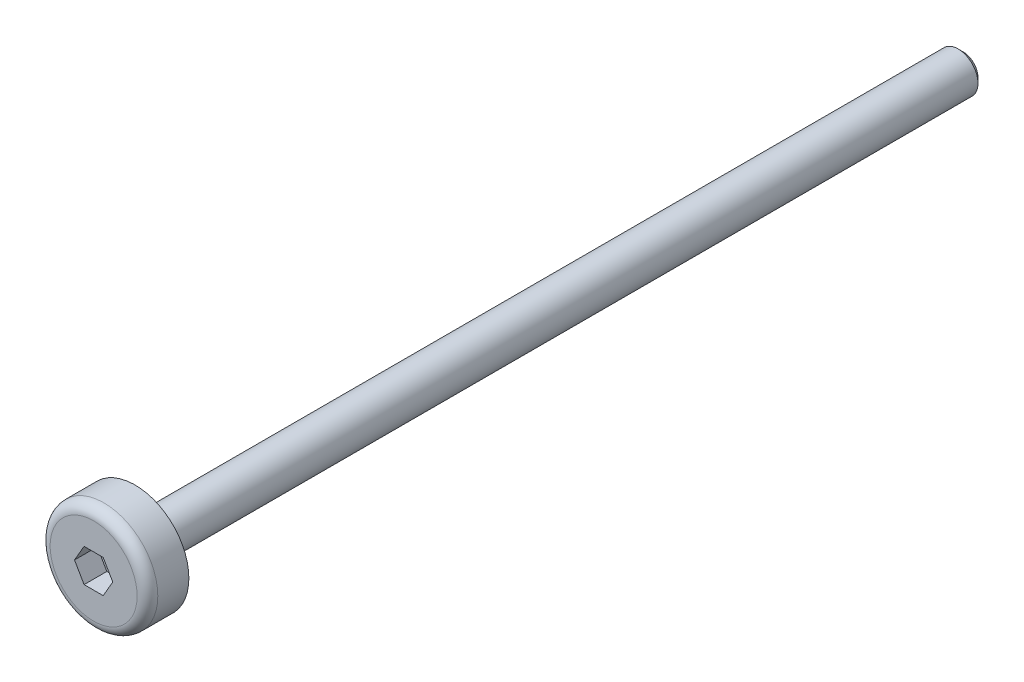
ISO-10303-21;
HEADER;
FILE_DESCRIPTION(('STEP AP214'),'2;1');
FILE_NAME('part.step','',(''),(''),'','','');
FILE_SCHEMA(('AUTOMOTIVE_DESIGN { 1 0 10303 214 1 1 1 1 }'));
ENDSEC;
DATA;
#1=APPLICATION_CONTEXT('core data for automotive mechanical design processes');
#2=APPLICATION_PROTOCOL_DEFINITION('international standard','automotive_design',2000,#1);
#3=PRODUCT_CONTEXT('',#1,'mechanical');
#4=PRODUCT('Part','Part','',(#3));
#5=PRODUCT_RELATED_PRODUCT_CATEGORY('part','',(#4));
#6=PRODUCT_DEFINITION_FORMATION('','',#4);
#7=PRODUCT_DEFINITION_CONTEXT('part definition',#1,'design');
#8=PRODUCT_DEFINITION('design','',#6,#7);
#9=PRODUCT_DEFINITION_SHAPE('','',#8);
#10=(LENGTH_UNIT() NAMED_UNIT(*) SI_UNIT(.MILLI.,.METRE.));
#11=(NAMED_UNIT(*) PLANE_ANGLE_UNIT() SI_UNIT($,.RADIAN.));
#12=(NAMED_UNIT(*) SI_UNIT($,.STERADIAN.) SOLID_ANGLE_UNIT());
#13=UNCERTAINTY_MEASURE_WITH_UNIT(LENGTH_MEASURE(1.E-05),#10,'distance_accuracy_value','');
#14=(GEOMETRIC_REPRESENTATION_CONTEXT(3) GLOBAL_UNCERTAINTY_ASSIGNED_CONTEXT((#13)) GLOBAL_UNIT_ASSIGNED_CONTEXT((#10,
#11,#12)) REPRESENTATION_CONTEXT('',''));
#15=CARTESIAN_POINT('',(0.,0.,0.));
#16=DIRECTION('',(0.,0.,1.));
#17=DIRECTION('',(1.,0.,0.));
#18=AXIS2_PLACEMENT_3D('',#15,#16,#17);
#19=CARTESIAN_POINT('',(0.,0.,-50.));
#20=DIRECTION('',(0.,0.,-1.));
#21=DIRECTION('',(-1.,0.,0.));
#22=AXIS2_PLACEMENT_3D('',#19,#20,#21);
#23=PLANE('',#22);
#24=CARTESIAN_POINT('',(0.,0.,-50.));
#25=DIRECTION('',(0.,0.,-1.));
#26=DIRECTION('',(-1.,0.,0.));
#27=AXIS2_PLACEMENT_3D('',#24,#25,#26);
#28=CIRCLE('',#27,0.899999999999984);
#29=CARTESIAN_POINT('',(-0.899999999999984,0.,-50.));
#30=VERTEX_POINT('',#29);
#31=EDGE_CURVE('E156',#30,#30,#28,.T.);
#32=ORIENTED_EDGE('',*,*,#31,.T.);
#33=EDGE_LOOP('',(#32));
#34=FACE_BOUND('',#33,.T.);
#35=ADVANCED_FACE('F40',(#34),#23,.T.);
#36=CARTESIAN_POINT('',(0.,0.,10.123));
#37=DIRECTION('',(0.,0.,1.));
#38=DIRECTION('',(1.,0.,0.));
#39=AXIS2_PLACEMENT_3D('',#36,#37,#38);
#40=CYLINDRICAL_SURFACE('',#39,1.2);
#41=CARTESIAN_POINT('',(0.,0.,-49.7));
#42=DIRECTION('',(0.,0.,-1.));
#43=DIRECTION('',(-1.,0.,0.));
#44=AXIS2_PLACEMENT_3D('',#41,#42,#43);
#45=CIRCLE('',#44,1.2);
#46=CARTESIAN_POINT('',(-1.2,0.,-49.7));
#47=VERTEX_POINT('',#46);
#48=EDGE_CURVE('E153',#47,#47,#45,.F.);
#49=ORIENTED_EDGE('',*,*,#48,.T.);
#50=EDGE_LOOP('',(#49));
#51=FACE_BOUND('',#50,.T.);
#52=CARTESIAN_POINT('',(0.,0.,0.));
#53=DIRECTION('',(0.,0.,1.));
#54=DIRECTION('',(1.,0.,0.));
#55=AXIS2_PLACEMENT_3D('',#52,#53,#54);
#56=CIRCLE('',#55,1.2);
#57=CARTESIAN_POINT('',(1.2,0.,0.));
#58=VERTEX_POINT('',#57);
#59=EDGE_CURVE('E150',#58,#58,#56,.T.);
#60=ORIENTED_EDGE('',*,*,#59,.F.);
#61=EDGE_LOOP('',(#60));
#62=FACE_BOUND('',#61,.T.);
#63=ADVANCED_FACE('F176',(#51,#62),#40,.T.);
#64=CARTESIAN_POINT('',(1.2,0.,0.));
#65=DIRECTION('',(0.,0.,-1.));
#66=DIRECTION('',(-1.,0.,0.));
#67=AXIS2_PLACEMENT_3D('',#64,#65,#66);
#68=PLANE('',#67);
#69=ORIENTED_EDGE('',*,*,#59,.T.);
#70=EDGE_LOOP('',(#69));
#71=FACE_BOUND('',#70,.T.);
#72=CARTESIAN_POINT('',(0.,0.,0.));
#73=DIRECTION('',(0.,0.,1.));
#74=DIRECTION('',(1.,0.,0.));
#75=AXIS2_PLACEMENT_3D('',#72,#73,#74);
#76=CIRCLE('',#75,3.25);
#77=CARTESIAN_POINT('',(3.25,0.,0.));
#78=VERTEX_POINT('',#77);
#79=EDGE_CURVE('E142',#78,#78,#76,.T.);
#80=ORIENTED_EDGE('',*,*,#79,.F.);
#81=EDGE_LOOP('',(#80));
#82=FACE_BOUND('',#81,.T.);
#83=ADVANCED_FACE('F182',(#71,#82),#68,.T.);
#84=CARTESIAN_POINT('',(0.,0.,10.123));
#85=DIRECTION('',(0.,0.,1.));
#86=DIRECTION('',(1.,0.,0.));
#87=AXIS2_PLACEMENT_3D('',#84,#85,#86);
#88=CYLINDRICAL_SURFACE('',#87,3.25);
#89=CARTESIAN_POINT('',(0.,0.,1.875));
#90=DIRECTION('',(0.,0.,1.));
#91=DIRECTION('',(1.,0.,0.));
#92=AXIS2_PLACEMENT_3D('',#89,#90,#91);
#93=CIRCLE('',#92,3.25);
#94=CARTESIAN_POINT('',(3.25,0.,1.875));
#95=VERTEX_POINT('',#94);
#96=EDGE_CURVE('E11',#95,#95,#93,.F.);
#97=ORIENTED_EDGE('',*,*,#96,.T.);
#98=EDGE_LOOP('',(#97));
#99=FACE_BOUND('',#98,.T.);
#100=ORIENTED_EDGE('',*,*,#79,.T.);
#101=EDGE_LOOP('',(#100));
#102=FACE_BOUND('',#101,.T.);
#103=ADVANCED_FACE('F191',(#99,#102),#88,.T.);
#104=CARTESIAN_POINT('',(3.25,0.,2.5));
#105=DIRECTION('',(0.,0.,1.));
#106=DIRECTION('',(1.,0.,0.));
#107=AXIS2_PLACEMENT_3D('',#104,#105,#106);
#108=PLANE('',#107);
#109=DIRECTION('',(0.499999999999995,0.866025403784441,0.));
#110=VECTOR('',#109,1.);
#111=CARTESIAN_POINT('',(0.577350269189637,-0.999999999999993,2.5));
#112=LINE('',#111,#110);
#113=CARTESIAN_POINT('',(0.577350269189637,-0.999999999999993,2.5));
#114=VERTEX_POINT('',#113);
#115=CARTESIAN_POINT('',(1.15470053837925,0.,2.5));
#116=VERTEX_POINT('',#115);
#117=EDGE_CURVE('E55',#114,#116,#112,.T.);
#118=ORIENTED_EDGE('',*,*,#117,.F.);
#119=DIRECTION('',(1.,0.,0.));
#120=VECTOR('',#119,1.);
#121=CARTESIAN_POINT('',(-0.577350269189617,-1.00000000000001,2.5));
#122=LINE('',#121,#120);
#123=CARTESIAN_POINT('',(-0.577350269189617,-1.00000000000001,2.5));
#124=VERTEX_POINT('',#123);
#125=EDGE_CURVE('E138',#124,#114,#122,.T.);
#126=ORIENTED_EDGE('',*,*,#125,.F.);
#127=DIRECTION('',(0.500000000000007,-0.866025403784434,0.));
#128=VECTOR('',#127,1.);
#129=CARTESIAN_POINT('',(-1.15470053837925,0.,2.5));
#130=LINE('',#129,#128);
#131=CARTESIAN_POINT('',(-1.15470053837925,0.,2.5));
#132=VERTEX_POINT('',#131);
#133=EDGE_CURVE('E136',#132,#124,#130,.T.);
#134=ORIENTED_EDGE('',*,*,#133,.F.);
#135=DIRECTION('',(-0.499999999999995,-0.866025403784442,0.));
#136=VECTOR('',#135,1.);
#137=CARTESIAN_POINT('',(-0.57735026918963,0.999999999999998,2.5));
#138=LINE('',#137,#136);
#139=CARTESIAN_POINT('',(-0.57735026918963,0.999999999999998,2.5));
#140=VERTEX_POINT('',#139);
#141=EDGE_CURVE('E103',#140,#132,#138,.T.);
#142=ORIENTED_EDGE('',*,*,#141,.F.);
#143=DIRECTION('',(-1.,0.,0.));
#144=VECTOR('',#143,1.);
#145=CARTESIAN_POINT('',(0.577350269189624,1.,2.5));
#146=LINE('',#145,#144);
#147=CARTESIAN_POINT('',(0.577350269189624,1.,2.5));
#148=VERTEX_POINT('',#147);
#149=EDGE_CURVE('E132',#148,#140,#146,.T.);
#150=ORIENTED_EDGE('',*,*,#149,.F.);
#151=DIRECTION('',(-0.500000000000001,0.866025403784438,0.));
#152=VECTOR('',#151,1.);
#153=CARTESIAN_POINT('',(1.15470053837925,0.,2.5));
#154=LINE('',#153,#152);
#155=EDGE_CURVE('E129',#116,#148,#154,.T.);
#156=ORIENTED_EDGE('',*,*,#155,.F.);
#157=EDGE_LOOP('',(#118,#126,#134,#142,#150,#156));
#158=FACE_BOUND('',#157,.T.);
#159=CARTESIAN_POINT('',(0.,0.,2.5));
#160=DIRECTION('',(0.,0.,1.));
#161=DIRECTION('',(1.,0.,0.));
#162=AXIS2_PLACEMENT_3D('',#159,#160,#161);
#163=CIRCLE('',#162,2.625);
#164=CARTESIAN_POINT('',(2.625,0.,2.5));
#165=VERTEX_POINT('',#164);
#166=EDGE_CURVE('E48',#165,#165,#163,.T.);
#167=ORIENTED_EDGE('',*,*,#166,.T.);
#168=EDGE_LOOP('',(#167));
#169=FACE_BOUND('',#168,.T.);
#170=ADVANCED_FACE('F161',(#158,#169),#108,.T.);
#171=CARTESIAN_POINT('',(0.,0.,-49.7));
#172=DIRECTION('',(0.,0.,1.));
#173=DIRECTION('',(1.,0.,0.));
#174=AXIS2_PLACEMENT_3D('',#171,#172,#173);
#175=CONICAL_SURFACE('',#174,1.2,0.785398163397437);
#176=ORIENTED_EDGE('',*,*,#31,.F.);
#177=EDGE_LOOP('',(#176));
#178=FACE_BOUND('',#177,.T.);
#179=ORIENTED_EDGE('',*,*,#48,.F.);
#180=EDGE_LOOP('',(#179));
#181=FACE_BOUND('',#180,.T.);
#182=ADVANCED_FACE('F165',(#178,#181),#175,.T.);
#183=CARTESIAN_POINT('',(0.,0.,1.875));
#184=DIRECTION('',(0.,0.,1.));
#185=DIRECTION('',(1.,0.,0.));
#186=AXIS2_PLACEMENT_3D('',#183,#184,#185);
#187=TOROIDAL_SURFACE('',#186,2.625,0.625);
#188=ORIENTED_EDGE('',*,*,#96,.F.);
#189=EDGE_LOOP('',(#188));
#190=FACE_BOUND('',#189,.T.);
#191=ORIENTED_EDGE('',*,*,#166,.F.);
#192=EDGE_LOOP('',(#191));
#193=FACE_BOUND('',#192,.T.);
#194=ADVANCED_FACE('F42',(#190,#193),#187,.T.);
#195=CARTESIAN_POINT('',(0.577350269189637,-0.999999999999993,1.125));
#196=DIRECTION('',(0.866025403784441,-0.499999999999995,0.));
#197=DIRECTION('',(0.499999999999995,0.866025403784441,0.));
#198=AXIS2_PLACEMENT_3D('',#195,#196,#197);
#199=PLANE('',#198);
#200=ORIENTED_EDGE('',*,*,#117,.T.);
#201=DIRECTION('',(0.,0.,1.));
#202=VECTOR('',#201,1.);
#203=CARTESIAN_POINT('',(1.15470053837925,0.,1.125));
#204=LINE('',#203,#202);
#205=CARTESIAN_POINT('',(1.15470053837925,0.,1.125));
#206=VERTEX_POINT('',#205);
#207=EDGE_CURVE('E85',#206,#116,#204,.T.);
#208=ORIENTED_EDGE('',*,*,#207,.F.);
#209=DIRECTION('',(0.499999999999995,0.866025403784441,0.));
#210=VECTOR('',#209,1.);
#211=CARTESIAN_POINT('',(0.577350269189637,-0.999999999999993,1.125));
#212=LINE('',#211,#210);
#213=CARTESIAN_POINT('',(0.577350269189637,-0.999999999999993,1.125));
#214=VERTEX_POINT('',#213);
#215=EDGE_CURVE('E140',#214,#206,#212,.T.);
#216=ORIENTED_EDGE('',*,*,#215,.F.);
#217=DIRECTION('',(0.,0.,1.));
#218=VECTOR('',#217,1.);
#219=CARTESIAN_POINT('',(0.577350269189637,-0.999999999999993,1.125));
#220=LINE('',#219,#218);
#221=EDGE_CURVE('E63',#214,#114,#220,.T.);
#222=ORIENTED_EDGE('',*,*,#221,.T.);
#223=EDGE_LOOP('',(#200,#208,#216,#222));
#224=FACE_BOUND('',#223,.T.);
#225=ADVANCED_FACE('F164',(#224),#199,.F.);
#226=CARTESIAN_POINT('',(-0.577350269189617,-1.00000000000001,1.125));
#227=DIRECTION('',(0.,-1.,0.));
#228=DIRECTION('',(1.,0.,0.));
#229=AXIS2_PLACEMENT_3D('',#226,#227,#228);
#230=PLANE('',#229);
#231=ORIENTED_EDGE('',*,*,#125,.T.);
#232=ORIENTED_EDGE('',*,*,#221,.F.);
#233=DIRECTION('',(1.,0.,0.));
#234=VECTOR('',#233,1.);
#235=CARTESIAN_POINT('',(-0.577350269189617,-1.00000000000001,1.125));
#236=LINE('',#235,#234);
#237=CARTESIAN_POINT('',(-0.577350269189617,-1.00000000000001,1.125));
#238=VERTEX_POINT('',#237);
#239=EDGE_CURVE('E115',#238,#214,#236,.T.);
#240=ORIENTED_EDGE('',*,*,#239,.F.);
#241=DIRECTION('',(0.,0.,1.));
#242=VECTOR('',#241,1.);
#243=CARTESIAN_POINT('',(-0.577350269189617,-1.00000000000001,1.125));
#244=LINE('',#243,#242);
#245=EDGE_CURVE('E107',#238,#124,#244,.T.);
#246=ORIENTED_EDGE('',*,*,#245,.T.);
#247=EDGE_LOOP('',(#231,#232,#240,#246));
#248=FACE_BOUND('',#247,.T.);
#249=ADVANCED_FACE('F171',(#248),#230,.F.);
#250=CARTESIAN_POINT('',(-1.15470053837925,0.,1.125));
#251=DIRECTION('',(-0.866025403784435,-0.500000000000007,0.));
#252=DIRECTION('',(0.500000000000007,-0.866025403784435,0.));
#253=AXIS2_PLACEMENT_3D('',#250,#251,#252);
#254=PLANE('',#253);
#255=ORIENTED_EDGE('',*,*,#133,.T.);
#256=ORIENTED_EDGE('',*,*,#245,.F.);
#257=DIRECTION('',(0.500000000000007,-0.866025403784434,0.));
#258=VECTOR('',#257,1.);
#259=CARTESIAN_POINT('',(-1.15470053837925,0.,1.125));
#260=LINE('',#259,#258);
#261=CARTESIAN_POINT('',(-1.15470053837925,0.,1.125));
#262=VERTEX_POINT('',#261);
#263=EDGE_CURVE('E111',#262,#238,#260,.T.);
#264=ORIENTED_EDGE('',*,*,#263,.F.);
#265=DIRECTION('',(0.,0.,1.));
#266=VECTOR('',#265,1.);
#267=CARTESIAN_POINT('',(-1.15470053837925,0.,1.125));
#268=LINE('',#267,#266);
#269=EDGE_CURVE('E96',#262,#132,#268,.T.);
#270=ORIENTED_EDGE('',*,*,#269,.T.);
#271=EDGE_LOOP('',(#255,#256,#264,#270));
#272=FACE_BOUND('',#271,.T.);
#273=ADVANCED_FACE('F112',(#272),#254,.F.);
#274=CARTESIAN_POINT('',(-0.57735026918963,0.999999999999998,1.125));
#275=DIRECTION('',(-0.866025403784442,0.499999999999995,0.));
#276=DIRECTION('',(-0.499999999999995,-0.866025403784441,0.));
#277=AXIS2_PLACEMENT_3D('',#274,#275,#276);
#278=PLANE('',#277);
#279=ORIENTED_EDGE('',*,*,#141,.T.);
#280=ORIENTED_EDGE('',*,*,#269,.F.);
#281=DIRECTION('',(-0.499999999999995,-0.866025403784442,0.));
#282=VECTOR('',#281,1.);
#283=CARTESIAN_POINT('',(-0.57735026918963,0.999999999999998,1.125));
#284=LINE('',#283,#282);
#285=CARTESIAN_POINT('',(-0.57735026918963,0.999999999999998,1.125));
#286=VERTEX_POINT('',#285);
#287=EDGE_CURVE('E100',#286,#262,#284,.T.);
#288=ORIENTED_EDGE('',*,*,#287,.F.);
#289=DIRECTION('',(0.,0.,1.));
#290=VECTOR('',#289,1.);
#291=CARTESIAN_POINT('',(-0.57735026918963,0.999999999999998,1.125));
#292=LINE('',#291,#290);
#293=EDGE_CURVE('E108',#286,#140,#292,.T.);
#294=ORIENTED_EDGE('',*,*,#293,.T.);
#295=EDGE_LOOP('',(#279,#280,#288,#294));
#296=FACE_BOUND('',#295,.T.);
#297=ADVANCED_FACE('F98',(#296),#278,.F.);
#298=CARTESIAN_POINT('',(0.577350269189624,1.,1.125));
#299=DIRECTION('',(0.,1.,0.));
#300=DIRECTION('',(-1.,0.,0.));
#301=AXIS2_PLACEMENT_3D('',#298,#299,#300);
#302=PLANE('',#301);
#303=ORIENTED_EDGE('',*,*,#149,.T.);
#304=ORIENTED_EDGE('',*,*,#293,.F.);
#305=DIRECTION('',(-1.,0.,0.));
#306=VECTOR('',#305,1.);
#307=CARTESIAN_POINT('',(0.577350269189624,1.,1.125));
#308=LINE('',#307,#306);
#309=CARTESIAN_POINT('',(0.577350269189624,1.,1.125));
#310=VERTEX_POINT('',#309);
#311=EDGE_CURVE('E121',#310,#286,#308,.T.);
#312=ORIENTED_EDGE('',*,*,#311,.F.);
#313=DIRECTION('',(0.,0.,1.));
#314=VECTOR('',#313,1.);
#315=CARTESIAN_POINT('',(0.577350269189624,1.,1.125));
#316=LINE('',#315,#314);
#317=EDGE_CURVE('E145',#310,#148,#316,.T.);
#318=ORIENTED_EDGE('',*,*,#317,.T.);
#319=EDGE_LOOP('',(#303,#304,#312,#318));
#320=FACE_BOUND('',#319,.T.);
#321=ADVANCED_FACE('F202',(#320),#302,.F.);
#322=CARTESIAN_POINT('',(1.15470053837925,0.,1.125));
#323=DIRECTION('',(0.866025403784438,0.500000000000001,0.));
#324=DIRECTION('',(-0.500000000000001,0.866025403784438,0.));
#325=AXIS2_PLACEMENT_3D('',#322,#323,#324);
#326=PLANE('',#325);
#327=ORIENTED_EDGE('',*,*,#155,.T.);
#328=ORIENTED_EDGE('',*,*,#317,.F.);
#329=DIRECTION('',(-0.500000000000001,0.866025403784438,0.));
#330=VECTOR('',#329,1.);
#331=CARTESIAN_POINT('',(1.15470053837925,0.,1.125));
#332=LINE('',#331,#330);
#333=EDGE_CURVE('E123',#206,#310,#332,.T.);
#334=ORIENTED_EDGE('',*,*,#333,.F.);
#335=ORIENTED_EDGE('',*,*,#207,.T.);
#336=EDGE_LOOP('',(#327,#328,#334,#335));
#337=FACE_BOUND('',#336,.T.);
#338=ADVANCED_FACE('F199',(#337),#326,.F.);
#339=CARTESIAN_POINT('',(0.,0.,1.125));
#340=DIRECTION('',(0.,0.,1.));
#341=DIRECTION('',(1.,0.,0.));
#342=AXIS2_PLACEMENT_3D('',#339,#340,#341);
#343=PLANE('',#342);
#344=ORIENTED_EDGE('',*,*,#215,.T.);
#345=ORIENTED_EDGE('',*,*,#333,.T.);
#346=ORIENTED_EDGE('',*,*,#311,.T.);
#347=ORIENTED_EDGE('',*,*,#287,.T.);
#348=ORIENTED_EDGE('',*,*,#263,.T.);
#349=ORIENTED_EDGE('',*,*,#239,.T.);
#350=EDGE_LOOP('',(#344,#345,#346,#347,#348,#349));
#351=FACE_BOUND('',#350,.T.);
#352=ADVANCED_FACE('F118',(#351),#343,.T.);
#353=CLOSED_SHELL('',(#35,#63,#83,#103,#170,#182,#194,#225,#249,#273,#297,#321,#338,#352));
#354=MANIFOLD_SOLID_BREP('B2',#353);
#355=ADVANCED_BREP_SHAPE_REPRESENTATION('',(#18,#354),#14);
#356=SHAPE_DEFINITION_REPRESENTATION(#9,#355);
ENDSEC;
END-ISO-10303-21;
